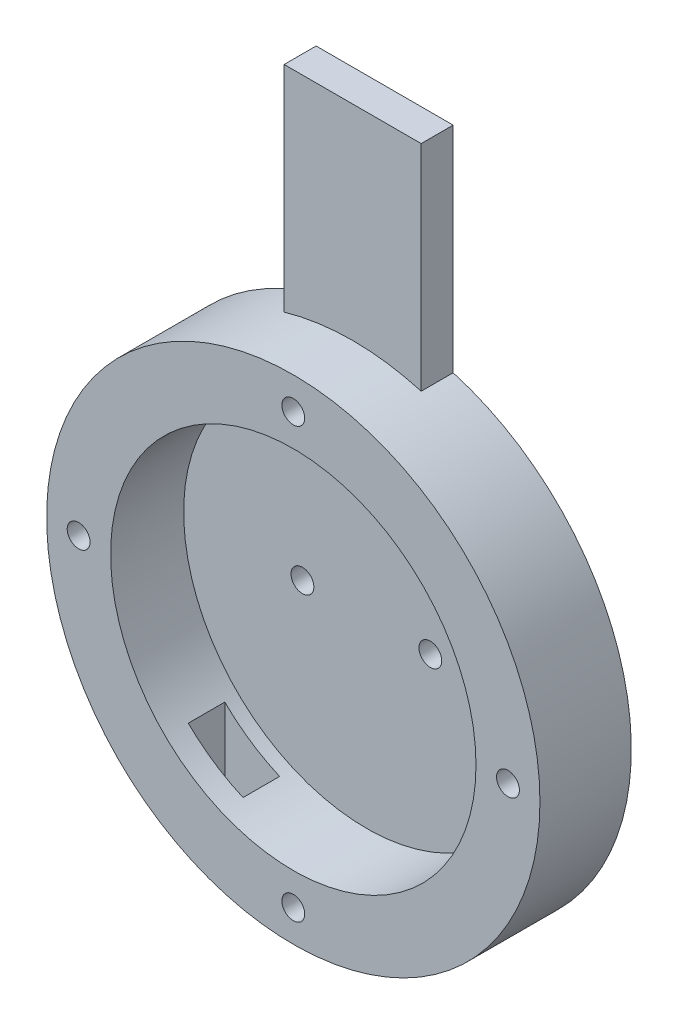
ISO-10303-21;
HEADER;
FILE_DESCRIPTION(('STEP AP214'),'2;1');
FILE_NAME('part.step','',(''),(''),'','','');
FILE_SCHEMA(('AUTOMOTIVE_DESIGN { 1 0 10303 214 1 1 1 1 }'));
ENDSEC;
DATA;
#1=APPLICATION_CONTEXT('core data for automotive mechanical design processes');
#2=APPLICATION_PROTOCOL_DEFINITION('international standard','automotive_design',2000,#1);
#3=PRODUCT_CONTEXT('',#1,'mechanical');
#4=PRODUCT('Part','Part','',(#3));
#5=PRODUCT_RELATED_PRODUCT_CATEGORY('part','',(#4));
#6=PRODUCT_DEFINITION_FORMATION('','',#4);
#7=PRODUCT_DEFINITION_CONTEXT('part definition',#1,'design');
#8=PRODUCT_DEFINITION('design','',#6,#7);
#9=PRODUCT_DEFINITION_SHAPE('','',#8);
#10=(LENGTH_UNIT() NAMED_UNIT(*) SI_UNIT(.MILLI.,.METRE.));
#11=(NAMED_UNIT(*) PLANE_ANGLE_UNIT() SI_UNIT($,.RADIAN.));
#12=(NAMED_UNIT(*) SI_UNIT($,.STERADIAN.) SOLID_ANGLE_UNIT());
#13=UNCERTAINTY_MEASURE_WITH_UNIT(LENGTH_MEASURE(1.E-05),#10,'distance_accuracy_value','');
#14=(GEOMETRIC_REPRESENTATION_CONTEXT(3) GLOBAL_UNCERTAINTY_ASSIGNED_CONTEXT((#13)) GLOBAL_UNIT_ASSIGNED_CONTEXT((#10,
#11,#12)) REPRESENTATION_CONTEXT('',''));
#15=CARTESIAN_POINT('',(0.,0.,0.));
#16=DIRECTION('',(0.,0.,1.));
#17=DIRECTION('',(1.,0.,0.));
#18=AXIS2_PLACEMENT_3D('',#15,#16,#17);
#19=CARTESIAN_POINT('',(0.,0.,10.));
#20=DIRECTION('',(0.,0.,-1.));
#21=DIRECTION('',(-1.,0.,0.));
#22=AXIS2_PLACEMENT_3D('',#19,#20,#21);
#23=CYLINDRICAL_SURFACE('',#22,27.);
#24=CARTESIAN_POINT('',(0.,0.,3.49999999999996));
#25=DIRECTION('',(0.,0.,-1.));
#26=DIRECTION('',(-1.,0.,0.));
#27=AXIS2_PLACEMENT_3D('',#24,#25,#26);
#28=CIRCLE('',#27,27.);
#29=CARTESIAN_POINT('',(-14.,-23.0867927612304,3.49999999999996));
#30=VERTEX_POINT('',#29);
#31=CARTESIAN_POINT('',(-8.,-25.7875939164553,3.49999999999996));
#32=VERTEX_POINT('',#31);
#33=EDGE_CURVE('E109',#30,#32,#28,.F.);
#34=ORIENTED_EDGE('',*,*,#33,.F.);
#35=DIRECTION('',(0.,0.,-1.));
#36=VECTOR('',#35,1.);
#37=CARTESIAN_POINT('',(-14.,-23.0867927612304,10.));
#38=LINE('',#37,#36);
#39=CARTESIAN_POINT('',(-14.,-23.0867927612304,7.49999999999996));
#40=VERTEX_POINT('',#39);
#41=EDGE_CURVE('E117',#40,#30,#38,.T.);
#42=ORIENTED_EDGE('',*,*,#41,.F.);
#43=CARTESIAN_POINT('',(0.,0.,7.49999999999996));
#44=DIRECTION('',(0.,0.,1.));
#45=DIRECTION('',(1.,0.,0.));
#46=AXIS2_PLACEMENT_3D('',#43,#44,#45);
#47=CIRCLE('',#46,27.);
#48=CARTESIAN_POINT('',(-8.,-25.7875939164553,7.49999999999996));
#49=VERTEX_POINT('',#48);
#50=EDGE_CURVE('E122',#49,#40,#47,.F.);
#51=ORIENTED_EDGE('',*,*,#50,.F.);
#52=DIRECTION('',(0.,0.,-1.));
#53=VECTOR('',#52,1.);
#54=CARTESIAN_POINT('',(-8.,-25.7875939164553,10.));
#55=LINE('',#54,#53);
#56=EDGE_CURVE('E54',#32,#49,#55,.F.);
#57=ORIENTED_EDGE('',*,*,#56,.F.);
#58=EDGE_LOOP('',(#34,#42,#51,#57));
#59=FACE_BOUND('',#58,.T.);
#60=CARTESIAN_POINT('',(0.,0.,10.));
#61=DIRECTION('',(0.,0.,1.));
#62=DIRECTION('',(1.,0.,0.));
#63=AXIS2_PLACEMENT_3D('',#60,#61,#62);
#64=CIRCLE('',#63,27.);
#65=CARTESIAN_POINT('',(27.,0.,10.));
#66=VERTEX_POINT('',#65);
#67=EDGE_CURVE('E220',#66,#66,#64,.T.);
#68=ORIENTED_EDGE('',*,*,#67,.F.);
#69=EDGE_LOOP('',(#68));
#70=FACE_BOUND('',#69,.T.);
#71=DIRECTION('',(0.,0.,-1.));
#72=VECTOR('',#71,1.);
#73=CARTESIAN_POINT('',(-7.5,25.9374246986859,10.));
#74=LINE('',#73,#72);
#75=CARTESIAN_POINT('',(-7.5,25.9374246986859,0.));
#76=VERTEX_POINT('',#75);
#77=CARTESIAN_POINT('',(-7.5,25.9374246986859,3.5));
#78=VERTEX_POINT('',#77);
#79=EDGE_CURVE('E238',#76,#78,#74,.F.);
#80=ORIENTED_EDGE('',*,*,#79,.F.);
#81=CARTESIAN_POINT('',(0.,0.,0.));
#82=DIRECTION('',(0.,0.,1.));
#83=DIRECTION('',(1.,0.,0.));
#84=AXIS2_PLACEMENT_3D('',#81,#82,#83);
#85=CIRCLE('',#84,27.);
#86=CARTESIAN_POINT('',(7.5,25.9374246986859,0.));
#87=VERTEX_POINT('',#86);
#88=EDGE_CURVE('E216',#76,#87,#85,.T.);
#89=ORIENTED_EDGE('',*,*,#88,.T.);
#90=DIRECTION('',(0.,0.,-1.));
#91=VECTOR('',#90,1.);
#92=CARTESIAN_POINT('',(7.5,25.9374246986859,10.));
#93=LINE('',#92,#91);
#94=CARTESIAN_POINT('',(7.5,25.9374246986859,3.5));
#95=VERTEX_POINT('',#94);
#96=EDGE_CURVE('E234',#95,#87,#93,.T.);
#97=ORIENTED_EDGE('',*,*,#96,.F.);
#98=CARTESIAN_POINT('',(0.,0.,3.5));
#99=DIRECTION('',(0.,0.,-1.));
#100=DIRECTION('',(-1.,0.,0.));
#101=AXIS2_PLACEMENT_3D('',#98,#99,#100);
#102=CIRCLE('',#101,27.);
#103=EDGE_CURVE('E230',#78,#95,#102,.T.);
#104=ORIENTED_EDGE('',*,*,#103,.F.);
#105=EDGE_LOOP('',(#80,#89,#97,#104));
#106=FACE_BOUND('',#105,.T.);
#107=ADVANCED_FACE('F39',(#59,#70,#106),#23,.T.);
#108=CARTESIAN_POINT('',(0.,0.,10.));
#109=DIRECTION('',(0.,0.,1.));
#110=DIRECTION('',(1.,0.,0.));
#111=AXIS2_PLACEMENT_3D('',#108,#109,#110);
#112=PLANE('',#111);
#113=CARTESIAN_POINT('',(1.327186583295E-12,-23.5,10.));
#114=DIRECTION('',(0.,0.,1.));
#115=DIRECTION('',(1.,0.,0.));
#116=AXIS2_PLACEMENT_3D('',#113,#114,#115);
#117=CIRCLE('',#116,1.25000000000143);
#118=CARTESIAN_POINT('',(1.25000000000276,-23.5,10.));
#119=VERTEX_POINT('',#118);
#120=EDGE_CURVE('E192',#119,#119,#117,.T.);
#121=ORIENTED_EDGE('',*,*,#120,.F.);
#122=EDGE_LOOP('',(#121));
#123=FACE_BOUND('',#122,.T.);
#124=CARTESIAN_POINT('',(0.,0.,10.));
#125=DIRECTION('',(0.,0.,1.));
#126=DIRECTION('',(1.,0.,0.));
#127=AXIS2_PLACEMENT_3D('',#124,#125,#126);
#128=CIRCLE('',#127,20.);
#129=CARTESIAN_POINT('',(20.,0.,10.));
#130=VERTEX_POINT('',#129);
#131=EDGE_CURVE('E204',#130,#130,#128,.T.);
#132=ORIENTED_EDGE('',*,*,#131,.F.);
#133=EDGE_LOOP('',(#132));
#134=FACE_BOUND('',#133,.T.);
#135=ORIENTED_EDGE('',*,*,#67,.T.);
#136=EDGE_LOOP('',(#135));
#137=FACE_BOUND('',#136,.T.);
#138=CARTESIAN_POINT('',(0.,23.5,10.));
#139=DIRECTION('',(0.,0.,1.));
#140=DIRECTION('',(1.,0.,0.));
#141=AXIS2_PLACEMENT_3D('',#138,#139,#140);
#142=CIRCLE('',#141,1.25);
#143=CARTESIAN_POINT('',(1.25,23.5,10.));
#144=VERTEX_POINT('',#143);
#145=EDGE_CURVE('E212',#144,#144,#142,.T.);
#146=ORIENTED_EDGE('',*,*,#145,.F.);
#147=EDGE_LOOP('',(#146));
#148=FACE_BOUND('',#147,.T.);
#149=CARTESIAN_POINT('',(23.5000000000007,6.635932916475E-13,10.));
#150=DIRECTION('',(0.,0.,1.));
#151=DIRECTION('',(1.,0.,0.));
#152=AXIS2_PLACEMENT_3D('',#149,#150,#151);
#153=CIRCLE('',#152,1.25000000000052);
#154=CARTESIAN_POINT('',(24.7500000000012,6.635932916475E-13,10.));
#155=VERTEX_POINT('',#154);
#156=EDGE_CURVE('E200',#155,#155,#153,.T.);
#157=ORIENTED_EDGE('',*,*,#156,.F.);
#158=EDGE_LOOP('',(#157));
#159=FACE_BOUND('',#158,.T.);
#160=CARTESIAN_POINT('',(-23.4999999999993,-6.66471211625496E-13,10.));
#161=DIRECTION('',(0.,0.,1.));
#162=DIRECTION('',(1.,0.,0.));
#163=AXIS2_PLACEMENT_3D('',#160,#161,#162);
#164=CIRCLE('',#163,1.25000000000107);
#165=CARTESIAN_POINT('',(-22.2499999999983,-6.66471211625496E-13,10.));
#166=VERTEX_POINT('',#165);
#167=EDGE_CURVE('E184',#166,#166,#164,.T.);
#168=ORIENTED_EDGE('',*,*,#167,.F.);
#169=EDGE_LOOP('',(#168));
#170=FACE_BOUND('',#169,.T.);
#171=ADVANCED_FACE('F262',(#123,#134,#137,#148,#159,#170),#112,.T.);
#172=CARTESIAN_POINT('',(0.,0.,0.));
#173=DIRECTION('',(0.,0.,1.));
#174=DIRECTION('',(1.,0.,0.));
#175=AXIS2_PLACEMENT_3D('',#172,#173,#174);
#176=PLANE('',#175);
#177=ORIENTED_EDGE('',*,*,#88,.F.);
#178=DIRECTION('',(0.,-1.,0.));
#179=VECTOR('',#178,1.);
#180=CARTESIAN_POINT('',(-7.5,25.2480046432268,0.));
#181=LINE('',#180,#179);
#182=CARTESIAN_POINT('',(-7.5,49.4144699126793,0.));
#183=VERTEX_POINT('',#182);
#184=EDGE_CURVE('E128',#183,#76,#181,.T.);
#185=ORIENTED_EDGE('',*,*,#184,.F.);
#186=DIRECTION('',(-1.,0.,0.));
#187=VECTOR('',#186,1.);
#188=CARTESIAN_POINT('',(-7.5,49.4144699126793,0.));
#189=LINE('',#188,#187);
#190=CARTESIAN_POINT('',(7.5,49.4144699126793,0.));
#191=VERTEX_POINT('',#190);
#192=EDGE_CURVE('E145',#191,#183,#189,.T.);
#193=ORIENTED_EDGE('',*,*,#192,.F.);
#194=DIRECTION('',(0.,1.,0.));
#195=VECTOR('',#194,1.);
#196=CARTESIAN_POINT('',(7.5,25.2480046432268,0.));
#197=LINE('',#196,#195);
#198=EDGE_CURVE('E155',#87,#191,#197,.T.);
#199=ORIENTED_EDGE('',*,*,#198,.F.);
#200=EDGE_LOOP('',(#177,#185,#193,#199));
#201=FACE_BOUND('',#200,.T.);
#202=CARTESIAN_POINT('',(7.,0.,0.));
#203=DIRECTION('',(0.,0.,1.));
#204=DIRECTION('',(1.,0.,0.));
#205=AXIS2_PLACEMENT_3D('',#202,#203,#204);
#206=CIRCLE('',#205,1.25);
#207=CARTESIAN_POINT('',(8.25,0.,0.));
#208=VERTEX_POINT('',#207);
#209=EDGE_CURVE('E167',#208,#208,#206,.T.);
#210=ORIENTED_EDGE('',*,*,#209,.T.);
#211=EDGE_LOOP('',(#210));
#212=FACE_BOUND('',#211,.T.);
#213=CARTESIAN_POINT('',(-7.,0.,0.));
#214=DIRECTION('',(0.,0.,1.));
#215=DIRECTION('',(1.,0.,0.));
#216=AXIS2_PLACEMENT_3D('',#213,#214,#215);
#217=CIRCLE('',#216,1.25);
#218=CARTESIAN_POINT('',(-5.75,0.,0.));
#219=VERTEX_POINT('',#218);
#220=EDGE_CURVE('E172',#219,#219,#217,.T.);
#221=ORIENTED_EDGE('',*,*,#220,.T.);
#222=EDGE_LOOP('',(#221));
#223=FACE_BOUND('',#222,.T.);
#224=CARTESIAN_POINT('',(-23.4999999999993,-6.66471211625496E-13,0.));
#225=DIRECTION('',(0.,0.,1.));
#226=DIRECTION('',(1.,0.,0.));
#227=AXIS2_PLACEMENT_3D('',#224,#225,#226);
#228=CIRCLE('',#227,1.25000000000107);
#229=CARTESIAN_POINT('',(-22.2499999999983,-6.66471211625496E-13,0.));
#230=VERTEX_POINT('',#229);
#231=EDGE_CURVE('E180',#230,#230,#228,.T.);
#232=ORIENTED_EDGE('',*,*,#231,.T.);
#233=EDGE_LOOP('',(#232));
#234=FACE_BOUND('',#233,.T.);
#235=CARTESIAN_POINT('',(1.327186583295E-12,-23.5,0.));
#236=DIRECTION('',(0.,0.,1.));
#237=DIRECTION('',(1.,0.,0.));
#238=AXIS2_PLACEMENT_3D('',#235,#236,#237);
#239=CIRCLE('',#238,1.25000000000143);
#240=CARTESIAN_POINT('',(1.25000000000276,-23.5,0.));
#241=VERTEX_POINT('',#240);
#242=EDGE_CURVE('E188',#241,#241,#239,.T.);
#243=ORIENTED_EDGE('',*,*,#242,.T.);
#244=EDGE_LOOP('',(#243));
#245=FACE_BOUND('',#244,.T.);
#246=CARTESIAN_POINT('',(23.5000000000007,6.635932916475E-13,0.));
#247=DIRECTION('',(0.,0.,1.));
#248=DIRECTION('',(1.,0.,0.));
#249=AXIS2_PLACEMENT_3D('',#246,#247,#248);
#250=CIRCLE('',#249,1.25000000000052);
#251=CARTESIAN_POINT('',(24.7500000000012,6.635932916475E-13,0.));
#252=VERTEX_POINT('',#251);
#253=EDGE_CURVE('E196',#252,#252,#250,.T.);
#254=ORIENTED_EDGE('',*,*,#253,.T.);
#255=EDGE_LOOP('',(#254));
#256=FACE_BOUND('',#255,.T.);
#257=CARTESIAN_POINT('',(0.,23.5,0.));
#258=DIRECTION('',(0.,0.,1.));
#259=DIRECTION('',(1.,0.,0.));
#260=AXIS2_PLACEMENT_3D('',#257,#258,#259);
#261=CIRCLE('',#260,1.25);
#262=CARTESIAN_POINT('',(1.25,23.5,0.));
#263=VERTEX_POINT('',#262);
#264=EDGE_CURVE('E211',#263,#263,#261,.T.);
#265=ORIENTED_EDGE('',*,*,#264,.T.);
#266=EDGE_LOOP('',(#265));
#267=FACE_BOUND('',#266,.T.);
#268=ADVANCED_FACE('F268',(#201,#212,#223,#234,#245,#256,#267),#176,.F.);
#269=CARTESIAN_POINT('',(0.,23.5,10.));
#270=DIRECTION('',(0.,0.,-1.));
#271=DIRECTION('',(-1.,0.,0.));
#272=AXIS2_PLACEMENT_3D('',#269,#270,#271);
#273=CYLINDRICAL_SURFACE('',#272,1.25);
#274=ORIENTED_EDGE('',*,*,#145,.T.);
#275=EDGE_LOOP('',(#274));
#276=FACE_BOUND('',#275,.T.);
#277=ORIENTED_EDGE('',*,*,#264,.F.);
#278=EDGE_LOOP('',(#277));
#279=FACE_BOUND('',#278,.T.);
#280=ADVANCED_FACE('F275',(#276,#279),#273,.F.);
#281=CARTESIAN_POINT('',(0.,0.,10.));
#282=DIRECTION('',(0.,0.,-1.));
#283=DIRECTION('',(-1.,0.,0.));
#284=AXIS2_PLACEMENT_3D('',#281,#282,#283);
#285=CYLINDRICAL_SURFACE('',#284,20.);
#286=DIRECTION('',(0.,0.,-1.));
#287=VECTOR('',#286,1.);
#288=CARTESIAN_POINT('',(-14.,-14.2828568570857,10.));
#289=LINE('',#288,#287);
#290=CARTESIAN_POINT('',(-14.,-14.2828568570857,3.49999999999996));
#291=VERTEX_POINT('',#290);
#292=CARTESIAN_POINT('',(-14.,-14.2828568570857,7.49999999999996));
#293=VERTEX_POINT('',#292);
#294=EDGE_CURVE('E11',#291,#293,#289,.F.);
#295=ORIENTED_EDGE('',*,*,#294,.F.);
#296=CARTESIAN_POINT('',(0.,0.,3.49999999999996));
#297=DIRECTION('',(0.,0.,-1.));
#298=DIRECTION('',(-1.,0.,0.));
#299=AXIS2_PLACEMENT_3D('',#296,#297,#298);
#300=CIRCLE('',#299,20.);
#301=CARTESIAN_POINT('',(-8.,-18.3303027798234,3.49999999999996));
#302=VERTEX_POINT('',#301);
#303=EDGE_CURVE('E47',#302,#291,#300,.T.);
#304=ORIENTED_EDGE('',*,*,#303,.F.);
#305=DIRECTION('',(0.,0.,-1.));
#306=VECTOR('',#305,1.);
#307=CARTESIAN_POINT('',(-8.,-18.3303027798234,10.));
#308=LINE('',#307,#306);
#309=CARTESIAN_POINT('',(-8.,-18.3303027798234,7.49999999999996));
#310=VERTEX_POINT('',#309);
#311=EDGE_CURVE('E245',#310,#302,#308,.T.);
#312=ORIENTED_EDGE('',*,*,#311,.F.);
#313=CARTESIAN_POINT('',(0.,0.,7.49999999999996));
#314=DIRECTION('',(0.,0.,1.));
#315=DIRECTION('',(1.,0.,0.));
#316=AXIS2_PLACEMENT_3D('',#313,#314,#315);
#317=CIRCLE('',#316,20.);
#318=EDGE_CURVE('E242',#293,#310,#317,.T.);
#319=ORIENTED_EDGE('',*,*,#318,.F.);
#320=EDGE_LOOP('',(#295,#304,#312,#319));
#321=FACE_BOUND('',#320,.T.);
#322=CARTESIAN_POINT('',(0.,0.,2.));
#323=DIRECTION('',(0.,0.,1.));
#324=DIRECTION('',(1.,0.,0.));
#325=AXIS2_PLACEMENT_3D('',#322,#323,#324);
#326=CIRCLE('',#325,20.);
#327=CARTESIAN_POINT('',(20.,0.,2.));
#328=VERTEX_POINT('',#327);
#329=EDGE_CURVE('E224',#328,#328,#326,.T.);
#330=ORIENTED_EDGE('',*,*,#329,.F.);
#331=EDGE_LOOP('',(#330));
#332=FACE_BOUND('',#331,.T.);
#333=ORIENTED_EDGE('',*,*,#131,.T.);
#334=EDGE_LOOP('',(#333));
#335=FACE_BOUND('',#334,.T.);
#336=ADVANCED_FACE('F252',(#321,#332,#335),#285,.F.);
#337=CARTESIAN_POINT('',(23.5000000000007,6.635932916475E-13,10.));
#338=DIRECTION('',(0.,0.,-1.));
#339=DIRECTION('',(-1.,0.,0.));
#340=AXIS2_PLACEMENT_3D('',#337,#338,#339);
#341=CYLINDRICAL_SURFACE('',#340,1.25000000000052);
#342=ORIENTED_EDGE('',*,*,#156,.T.);
#343=EDGE_LOOP('',(#342));
#344=FACE_BOUND('',#343,.T.);
#345=ORIENTED_EDGE('',*,*,#253,.F.);
#346=EDGE_LOOP('',(#345));
#347=FACE_BOUND('',#346,.T.);
#348=ADVANCED_FACE('F283',(#344,#347),#341,.F.);
#349=CARTESIAN_POINT('',(1.327186583295E-12,-23.5,10.));
#350=DIRECTION('',(0.,0.,-1.));
#351=DIRECTION('',(-1.,0.,0.));
#352=AXIS2_PLACEMENT_3D('',#349,#350,#351);
#353=CYLINDRICAL_SURFACE('',#352,1.25000000000143);
#354=ORIENTED_EDGE('',*,*,#120,.T.);
#355=EDGE_LOOP('',(#354));
#356=FACE_BOUND('',#355,.T.);
#357=ORIENTED_EDGE('',*,*,#242,.F.);
#358=EDGE_LOOP('',(#357));
#359=FACE_BOUND('',#358,.T.);
#360=ADVANCED_FACE('F286',(#356,#359),#353,.F.);
#361=CARTESIAN_POINT('',(-23.4999999999993,-6.66471211625496E-13,10.));
#362=DIRECTION('',(0.,0.,-1.));
#363=DIRECTION('',(-1.,0.,0.));
#364=AXIS2_PLACEMENT_3D('',#361,#362,#363);
#365=CYLINDRICAL_SURFACE('',#364,1.25000000000107);
#366=ORIENTED_EDGE('',*,*,#167,.T.);
#367=EDGE_LOOP('',(#366));
#368=FACE_BOUND('',#367,.T.);
#369=ORIENTED_EDGE('',*,*,#231,.F.);
#370=EDGE_LOOP('',(#369));
#371=FACE_BOUND('',#370,.T.);
#372=ADVANCED_FACE('F290',(#368,#371),#365,.F.);
#373=CARTESIAN_POINT('',(0.,0.,2.));
#374=DIRECTION('',(0.,0.,1.));
#375=DIRECTION('',(1.,0.,0.));
#376=AXIS2_PLACEMENT_3D('',#373,#374,#375);
#377=PLANE('',#376);
#378=CARTESIAN_POINT('',(-7.,0.,2.));
#379=DIRECTION('',(0.,0.,1.));
#380=DIRECTION('',(1.,0.,0.));
#381=AXIS2_PLACEMENT_3D('',#378,#379,#380);
#382=CIRCLE('',#381,1.25);
#383=CARTESIAN_POINT('',(-5.75,0.,2.));
#384=VERTEX_POINT('',#383);
#385=EDGE_CURVE('E176',#384,#384,#382,.T.);
#386=ORIENTED_EDGE('',*,*,#385,.F.);
#387=EDGE_LOOP('',(#386));
#388=FACE_BOUND('',#387,.T.);
#389=ORIENTED_EDGE('',*,*,#329,.T.);
#390=EDGE_LOOP('',(#389));
#391=FACE_BOUND('',#390,.T.);
#392=CARTESIAN_POINT('',(7.,0.,2.));
#393=DIRECTION('',(0.,0.,1.));
#394=DIRECTION('',(1.,0.,0.));
#395=AXIS2_PLACEMENT_3D('',#392,#393,#394);
#396=CIRCLE('',#395,1.25);
#397=CARTESIAN_POINT('',(8.25,0.,2.));
#398=VERTEX_POINT('',#397);
#399=EDGE_CURVE('E168',#398,#398,#396,.T.);
#400=ORIENTED_EDGE('',*,*,#399,.F.);
#401=EDGE_LOOP('',(#400));
#402=FACE_BOUND('',#401,.T.);
#403=ADVANCED_FACE('F294',(#388,#391,#402),#377,.T.);
#404=CARTESIAN_POINT('',(-7.,0.,2.));
#405=DIRECTION('',(0.,0.,-1.));
#406=DIRECTION('',(-1.,0.,0.));
#407=AXIS2_PLACEMENT_3D('',#404,#405,#406);
#408=CYLINDRICAL_SURFACE('',#407,1.25);
#409=ORIENTED_EDGE('',*,*,#385,.T.);
#410=EDGE_LOOP('',(#409));
#411=FACE_BOUND('',#410,.T.);
#412=ORIENTED_EDGE('',*,*,#220,.F.);
#413=EDGE_LOOP('',(#412));
#414=FACE_BOUND('',#413,.T.);
#415=ADVANCED_FACE('F298',(#411,#414),#408,.F.);
#416=CARTESIAN_POINT('',(7.,0.,2.));
#417=DIRECTION('',(0.,0.,-1.));
#418=DIRECTION('',(-1.,0.,0.));
#419=AXIS2_PLACEMENT_3D('',#416,#417,#418);
#420=CYLINDRICAL_SURFACE('',#419,1.25);
#421=ORIENTED_EDGE('',*,*,#399,.T.);
#422=EDGE_LOOP('',(#421));
#423=FACE_BOUND('',#422,.T.);
#424=ORIENTED_EDGE('',*,*,#209,.F.);
#425=EDGE_LOOP('',(#424));
#426=FACE_BOUND('',#425,.T.);
#427=ADVANCED_FACE('F302',(#423,#426),#420,.F.);
#428=CARTESIAN_POINT('',(-7.5,25.2480046432268,3.5));
#429=DIRECTION('',(1.,0.,0.));
#430=DIRECTION('',(0.,0.,-1.));
#431=AXIS2_PLACEMENT_3D('',#428,#429,#430);
#432=PLANE('',#431);
#433=ORIENTED_EDGE('',*,*,#184,.T.);
#434=ORIENTED_EDGE('',*,*,#79,.T.);
#435=DIRECTION('',(0.,-1.,0.));
#436=VECTOR('',#435,1.);
#437=CARTESIAN_POINT('',(-7.5,25.2480046432268,3.5));
#438=LINE('',#437,#436);
#439=CARTESIAN_POINT('',(-7.5,49.4144699126793,3.5));
#440=VERTEX_POINT('',#439);
#441=EDGE_CURVE('E140',#440,#78,#438,.T.);
#442=ORIENTED_EDGE('',*,*,#441,.F.);
#443=DIRECTION('',(0.,0.,-1.));
#444=VECTOR('',#443,1.);
#445=CARTESIAN_POINT('',(-7.5,49.4144699126793,3.5));
#446=LINE('',#445,#444);
#447=EDGE_CURVE('E151',#440,#183,#446,.T.);
#448=ORIENTED_EDGE('',*,*,#447,.T.);
#449=EDGE_LOOP('',(#433,#434,#442,#448));
#450=FACE_BOUND('',#449,.T.);
#451=ADVANCED_FACE('F306',(#450),#432,.F.);
#452=CARTESIAN_POINT('',(7.5,25.2480046432268,3.5));
#453=DIRECTION('',(-1.,0.,0.));
#454=DIRECTION('',(0.,0.,1.));
#455=AXIS2_PLACEMENT_3D('',#452,#453,#454);
#456=PLANE('',#455);
#457=DIRECTION('',(0.,1.,0.));
#458=VECTOR('',#457,1.);
#459=CARTESIAN_POINT('',(7.5,25.2480046432268,3.5));
#460=LINE('',#459,#458);
#461=CARTESIAN_POINT('',(7.5,49.4144699126793,3.5));
#462=VERTEX_POINT('',#461);
#463=EDGE_CURVE('E144',#95,#462,#460,.T.);
#464=ORIENTED_EDGE('',*,*,#463,.F.);
#465=ORIENTED_EDGE('',*,*,#96,.T.);
#466=ORIENTED_EDGE('',*,*,#198,.T.);
#467=DIRECTION('',(0.,0.,-1.));
#468=VECTOR('',#467,1.);
#469=CARTESIAN_POINT('',(7.5,49.4144699126793,3.5));
#470=LINE('',#469,#468);
#471=EDGE_CURVE('E163',#462,#191,#470,.T.);
#472=ORIENTED_EDGE('',*,*,#471,.F.);
#473=EDGE_LOOP('',(#464,#465,#466,#472));
#474=FACE_BOUND('',#473,.T.);
#475=ADVANCED_FACE('F310',(#474),#456,.F.);
#476=CARTESIAN_POINT('',(-7.5,49.4144699126793,3.5));
#477=DIRECTION('',(0.,-1.,0.));
#478=DIRECTION('',(0.,0.,-1.));
#479=AXIS2_PLACEMENT_3D('',#476,#477,#478);
#480=PLANE('',#479);
#481=ORIENTED_EDGE('',*,*,#192,.T.);
#482=ORIENTED_EDGE('',*,*,#447,.F.);
#483=DIRECTION('',(-1.,0.,0.));
#484=VECTOR('',#483,1.);
#485=CARTESIAN_POINT('',(-7.5,49.4144699126793,3.5));
#486=LINE('',#485,#484);
#487=EDGE_CURVE('E148',#462,#440,#486,.T.);
#488=ORIENTED_EDGE('',*,*,#487,.F.);
#489=ORIENTED_EDGE('',*,*,#471,.T.);
#490=EDGE_LOOP('',(#481,#482,#488,#489));
#491=FACE_BOUND('',#490,.T.);
#492=ADVANCED_FACE('F314',(#491),#480,.F.);
#493=CARTESIAN_POINT('',(0.,0.,3.5));
#494=DIRECTION('',(0.,0.,-1.));
#495=DIRECTION('',(-1.,0.,0.));
#496=AXIS2_PLACEMENT_3D('',#493,#494,#495);
#497=PLANE('',#496);
#498=ORIENTED_EDGE('',*,*,#441,.T.);
#499=ORIENTED_EDGE('',*,*,#103,.T.);
#500=ORIENTED_EDGE('',*,*,#463,.T.);
#501=ORIENTED_EDGE('',*,*,#487,.T.);
#502=EDGE_LOOP('',(#498,#499,#500,#501));
#503=FACE_BOUND('',#502,.T.);
#504=ADVANCED_FACE('F318',(#503),#497,.F.);
#505=CARTESIAN_POINT('',(-14.,-27.001,3.49999999999996));
#506=DIRECTION('',(-1.,0.,0.));
#507=DIRECTION('',(0.,0.,1.));
#508=AXIS2_PLACEMENT_3D('',#505,#506,#507);
#509=PLANE('',#508);
#510=ORIENTED_EDGE('',*,*,#294,.T.);
#511=DIRECTION('',(0.,1.,0.));
#512=VECTOR('',#511,1.);
#513=CARTESIAN_POINT('',(-14.,-27.001,7.49999999999996));
#514=LINE('',#513,#512);
#515=EDGE_CURVE('E62',#40,#293,#514,.T.);
#516=ORIENTED_EDGE('',*,*,#515,.F.);
#517=ORIENTED_EDGE('',*,*,#41,.T.);
#518=DIRECTION('',(0.,1.,0.));
#519=VECTOR('',#518,1.);
#520=CARTESIAN_POINT('',(-14.,-27.001,3.49999999999996));
#521=LINE('',#520,#519);
#522=EDGE_CURVE('E104',#30,#291,#521,.T.);
#523=ORIENTED_EDGE('',*,*,#522,.T.);
#524=EDGE_LOOP('',(#510,#516,#517,#523));
#525=FACE_BOUND('',#524,.T.);
#526=ADVANCED_FACE('F118',(#525),#509,.F.);
#527=CARTESIAN_POINT('',(-14.,-27.001,3.49999999999996));
#528=DIRECTION('',(0.,0.,-1.));
#529=DIRECTION('',(-1.,0.,0.));
#530=AXIS2_PLACEMENT_3D('',#527,#528,#529);
#531=PLANE('',#530);
#532=ORIENTED_EDGE('',*,*,#303,.T.);
#533=ORIENTED_EDGE('',*,*,#522,.F.);
#534=ORIENTED_EDGE('',*,*,#33,.T.);
#535=DIRECTION('',(0.,1.,0.));
#536=VECTOR('',#535,1.);
#537=CARTESIAN_POINT('',(-8.,-27.001,3.49999999999996));
#538=LINE('',#537,#536);
#539=EDGE_CURVE('E114',#32,#302,#538,.T.);
#540=ORIENTED_EDGE('',*,*,#539,.T.);
#541=EDGE_LOOP('',(#532,#533,#534,#540));
#542=FACE_BOUND('',#541,.T.);
#543=ADVANCED_FACE('F106',(#542),#531,.F.);
#544=CARTESIAN_POINT('',(-8.,-27.001,3.49999999999996));
#545=DIRECTION('',(1.,0.,0.));
#546=DIRECTION('',(0.,0.,-1.));
#547=AXIS2_PLACEMENT_3D('',#544,#545,#546);
#548=PLANE('',#547);
#549=ORIENTED_EDGE('',*,*,#311,.T.);
#550=ORIENTED_EDGE('',*,*,#539,.F.);
#551=ORIENTED_EDGE('',*,*,#56,.T.);
#552=DIRECTION('',(0.,1.,0.));
#553=VECTOR('',#552,1.);
#554=CARTESIAN_POINT('',(-8.,-27.001,7.49999999999996));
#555=LINE('',#554,#553);
#556=EDGE_CURVE('E132',#49,#310,#555,.T.);
#557=ORIENTED_EDGE('',*,*,#556,.T.);
#558=EDGE_LOOP('',(#549,#550,#551,#557));
#559=FACE_BOUND('',#558,.T.);
#560=ADVANCED_FACE('F249',(#559),#548,.F.);
#561=CARTESIAN_POINT('',(-14.,-27.001,7.49999999999996));
#562=DIRECTION('',(0.,0.,1.));
#563=DIRECTION('',(1.,0.,0.));
#564=AXIS2_PLACEMENT_3D('',#561,#562,#563);
#565=PLANE('',#564);
#566=ORIENTED_EDGE('',*,*,#318,.T.);
#567=ORIENTED_EDGE('',*,*,#556,.F.);
#568=ORIENTED_EDGE('',*,*,#50,.T.);
#569=ORIENTED_EDGE('',*,*,#515,.T.);
#570=EDGE_LOOP('',(#566,#567,#568,#569));
#571=FACE_BOUND('',#570,.T.);
#572=ADVANCED_FACE('F254',(#571),#565,.F.);
#573=CLOSED_SHELL('',(#107,#171,#268,#280,#336,#348,#360,#372,#403,#415,#427,#451,#475,#492,
#504,#526,#543,#560,#572));
#574=MANIFOLD_SOLID_BREP('B2',#573);
#575=ADVANCED_BREP_SHAPE_REPRESENTATION('',(#18,#574),#14);
#576=SHAPE_DEFINITION_REPRESENTATION(#9,#575);
ENDSEC;
END-ISO-10303-21;
